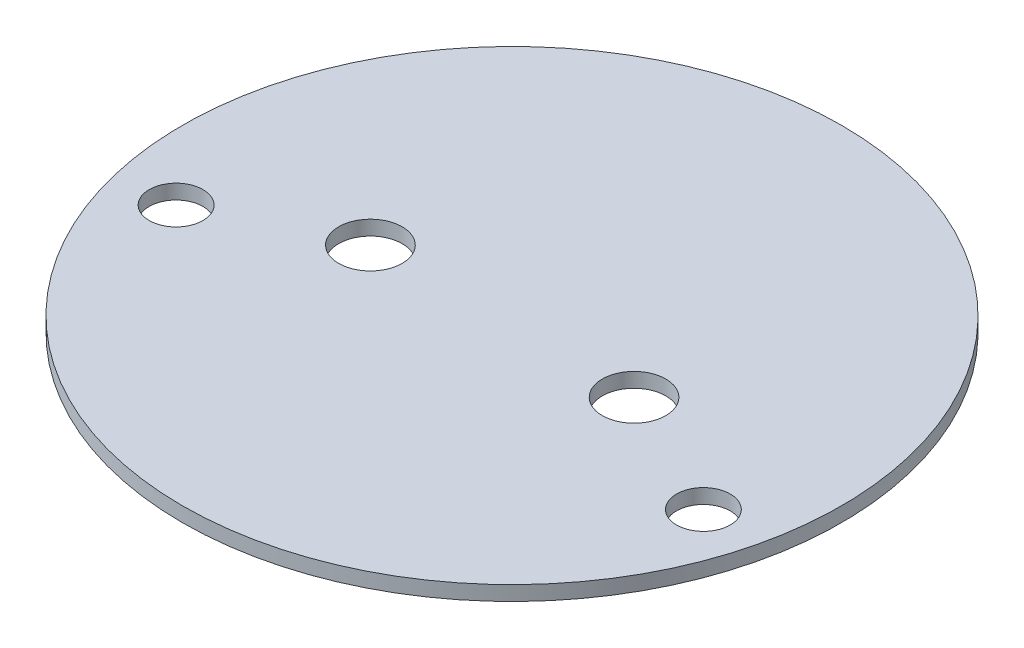
ISO-10303-21;
HEADER;
FILE_DESCRIPTION(('STEP AP214'),'2;1');
FILE_NAME('part.step','',(''),(''),'','','');
FILE_SCHEMA(('AUTOMOTIVE_DESIGN { 1 0 10303 214 1 1 1 1 }'));
ENDSEC;
DATA;
#1=APPLICATION_CONTEXT('core data for automotive mechanical design processes');
#2=APPLICATION_PROTOCOL_DEFINITION('international standard','automotive_design',2000,#1);
#3=PRODUCT_CONTEXT('',#1,'mechanical');
#4=PRODUCT('Part','Part','',(#3));
#5=PRODUCT_RELATED_PRODUCT_CATEGORY('part','',(#4));
#6=PRODUCT_DEFINITION_FORMATION('','',#4);
#7=PRODUCT_DEFINITION_CONTEXT('part definition',#1,'design');
#8=PRODUCT_DEFINITION('design','',#6,#7);
#9=PRODUCT_DEFINITION_SHAPE('','',#8);
#10=(LENGTH_UNIT() NAMED_UNIT(*) SI_UNIT(.MILLI.,.METRE.));
#11=(NAMED_UNIT(*) PLANE_ANGLE_UNIT() SI_UNIT($,.RADIAN.));
#12=(NAMED_UNIT(*) SI_UNIT($,.STERADIAN.) SOLID_ANGLE_UNIT());
#13=UNCERTAINTY_MEASURE_WITH_UNIT(LENGTH_MEASURE(1.E-05),#10,'distance_accuracy_value','');
#14=(GEOMETRIC_REPRESENTATION_CONTEXT(3) GLOBAL_UNCERTAINTY_ASSIGNED_CONTEXT((#13)) GLOBAL_UNIT_ASSIGNED_CONTEXT((#10,
#11,#12)) REPRESENTATION_CONTEXT('',''));
#15=CARTESIAN_POINT('',(0.,0.,0.));
#16=DIRECTION('',(0.,0.,1.));
#17=DIRECTION('',(1.,0.,0.));
#18=AXIS2_PLACEMENT_3D('',#15,#16,#17);
#19=CARTESIAN_POINT('',(0.,1.5,0.));
#20=DIRECTION('',(0.,1.,0.));
#21=DIRECTION('',(0.,0.,1.));
#22=AXIS2_PLACEMENT_3D('',#19,#20,#21);
#23=PLANE('',#22);
#24=CARTESIAN_POINT('',(-13.5,1.5,1.));
#25=DIRECTION('',(0.,1.,0.));
#26=DIRECTION('',(0.,0.,1.));
#27=AXIS2_PLACEMENT_3D('',#24,#25,#26);
#28=CIRCLE('',#27,3.25);
#29=CARTESIAN_POINT('',(-13.5,1.5,4.25));
#30=VERTEX_POINT('',#29);
#31=EDGE_CURVE('E68',#30,#30,#28,.T.);
#32=ORIENTED_EDGE('',*,*,#31,.F.);
#33=EDGE_LOOP('',(#32));
#34=FACE_BOUND('',#33,.T.);
#35=CARTESIAN_POINT('',(-27.,1.5,7.4));
#36=DIRECTION('',(0.,1.,0.));
#37=DIRECTION('',(0.,0.,1.));
#38=AXIS2_PLACEMENT_3D('',#35,#36,#37);
#39=CIRCLE('',#38,2.75);
#40=CARTESIAN_POINT('',(-27.,1.5,10.15));
#41=VERTEX_POINT('',#40);
#42=EDGE_CURVE('E54',#41,#41,#39,.T.);
#43=ORIENTED_EDGE('',*,*,#42,.F.);
#44=EDGE_LOOP('',(#43));
#45=FACE_BOUND('',#44,.T.);
#46=CARTESIAN_POINT('',(0.,1.5,0.));
#47=DIRECTION('',(0.,1.,0.));
#48=DIRECTION('',(0.,0.,1.));
#49=AXIS2_PLACEMENT_3D('',#46,#47,#48);
#50=CIRCLE('',#49,33.75);
#51=CARTESIAN_POINT('',(0.,1.5,33.75));
#52=VERTEX_POINT('',#51);
#53=EDGE_CURVE('E10',#52,#52,#50,.T.);
#54=ORIENTED_EDGE('',*,*,#53,.T.);
#55=EDGE_LOOP('',(#54));
#56=FACE_BOUND('',#55,.T.);
#57=CARTESIAN_POINT('',(27.,1.5,7.4));
#58=DIRECTION('',(0.,1.,0.));
#59=DIRECTION('',(0.,0.,1.));
#60=AXIS2_PLACEMENT_3D('',#57,#58,#59);
#61=CIRCLE('',#60,2.75);
#62=CARTESIAN_POINT('',(27.,1.5,10.15));
#63=VERTEX_POINT('',#62);
#64=EDGE_CURVE('E60',#63,#63,#61,.T.);
#65=ORIENTED_EDGE('',*,*,#64,.F.);
#66=EDGE_LOOP('',(#65));
#67=FACE_BOUND('',#66,.T.);
#68=CARTESIAN_POINT('',(13.5,1.5,1.));
#69=DIRECTION('',(0.,1.,0.));
#70=DIRECTION('',(0.,0.,1.));
#71=AXIS2_PLACEMENT_3D('',#68,#69,#70);
#72=CIRCLE('',#71,3.25);
#73=CARTESIAN_POINT('',(13.5,1.5,4.25));
#74=VERTEX_POINT('',#73);
#75=EDGE_CURVE('E76',#74,#74,#72,.T.);
#76=ORIENTED_EDGE('',*,*,#75,.F.);
#77=EDGE_LOOP('',(#76));
#78=FACE_BOUND('',#77,.T.);
#79=ADVANCED_FACE('F41',(#34,#45,#56,#67,#78),#23,.T.);
#80=CARTESIAN_POINT('',(0.,0.,0.));
#81=DIRECTION('',(0.,1.,0.));
#82=DIRECTION('',(0.,0.,1.));
#83=AXIS2_PLACEMENT_3D('',#80,#81,#82);
#84=PLANE('',#83);
#85=CARTESIAN_POINT('',(0.,0.,0.));
#86=DIRECTION('',(0.,1.,0.));
#87=DIRECTION('',(0.,0.,1.));
#88=AXIS2_PLACEMENT_3D('',#85,#86,#87);
#89=CIRCLE('',#88,33.75);
#90=CARTESIAN_POINT('',(0.,0.,33.75));
#91=VERTEX_POINT('',#90);
#92=EDGE_CURVE('E45',#91,#91,#89,.T.);
#93=ORIENTED_EDGE('',*,*,#92,.F.);
#94=EDGE_LOOP('',(#93));
#95=FACE_BOUND('',#94,.T.);
#96=CARTESIAN_POINT('',(-27.,0.,7.4));
#97=DIRECTION('',(0.,1.,0.));
#98=DIRECTION('',(0.,0.,1.));
#99=AXIS2_PLACEMENT_3D('',#96,#97,#98);
#100=CIRCLE('',#99,2.75);
#101=CARTESIAN_POINT('',(-27.,0.,10.15));
#102=VERTEX_POINT('',#101);
#103=EDGE_CURVE('E56',#102,#102,#100,.T.);
#104=ORIENTED_EDGE('',*,*,#103,.T.);
#105=EDGE_LOOP('',(#104));
#106=FACE_BOUND('',#105,.T.);
#107=CARTESIAN_POINT('',(27.,0.,7.4));
#108=DIRECTION('',(0.,1.,0.));
#109=DIRECTION('',(0.,0.,1.));
#110=AXIS2_PLACEMENT_3D('',#107,#108,#109);
#111=CIRCLE('',#110,2.75);
#112=CARTESIAN_POINT('',(27.,0.,10.15));
#113=VERTEX_POINT('',#112);
#114=EDGE_CURVE('E64',#113,#113,#111,.T.);
#115=ORIENTED_EDGE('',*,*,#114,.T.);
#116=EDGE_LOOP('',(#115));
#117=FACE_BOUND('',#116,.T.);
#118=CARTESIAN_POINT('',(-13.5,0.,1.));
#119=DIRECTION('',(0.,1.,0.));
#120=DIRECTION('',(0.,0.,1.));
#121=AXIS2_PLACEMENT_3D('',#118,#119,#120);
#122=CIRCLE('',#121,3.25);
#123=CARTESIAN_POINT('',(-13.5,0.,4.25));
#124=VERTEX_POINT('',#123);
#125=EDGE_CURVE('E72',#124,#124,#122,.T.);
#126=ORIENTED_EDGE('',*,*,#125,.T.);
#127=EDGE_LOOP('',(#126));
#128=FACE_BOUND('',#127,.T.);
#129=CARTESIAN_POINT('',(13.5,0.,1.));
#130=DIRECTION('',(0.,1.,0.));
#131=DIRECTION('',(0.,0.,1.));
#132=AXIS2_PLACEMENT_3D('',#129,#130,#131);
#133=CIRCLE('',#132,3.25);
#134=CARTESIAN_POINT('',(13.5,0.,4.25));
#135=VERTEX_POINT('',#134);
#136=EDGE_CURVE('E80',#135,#135,#133,.T.);
#137=ORIENTED_EDGE('',*,*,#136,.T.);
#138=EDGE_LOOP('',(#137));
#139=FACE_BOUND('',#138,.T.);
#140=ADVANCED_FACE('F92',(#95,#106,#117,#128,#139),#84,.F.);
#141=CARTESIAN_POINT('',(0.,1.5,0.));
#142=DIRECTION('',(0.,-1.,0.));
#143=DIRECTION('',(0.,0.,-1.));
#144=AXIS2_PLACEMENT_3D('',#141,#142,#143);
#145=CYLINDRICAL_SURFACE('',#144,33.75);
#146=ORIENTED_EDGE('',*,*,#53,.F.);
#147=EDGE_LOOP('',(#146));
#148=FACE_BOUND('',#147,.T.);
#149=ORIENTED_EDGE('',*,*,#92,.T.);
#150=EDGE_LOOP('',(#149));
#151=FACE_BOUND('',#150,.T.);
#152=ADVANCED_FACE('F43',(#148,#151),#145,.T.);
#153=CARTESIAN_POINT('',(-27.,1.5,7.4));
#154=DIRECTION('',(0.,-1.,0.));
#155=DIRECTION('',(0.,0.,-1.));
#156=AXIS2_PLACEMENT_3D('',#153,#154,#155);
#157=CYLINDRICAL_SURFACE('',#156,2.75);
#158=ORIENTED_EDGE('',*,*,#42,.T.);
#159=EDGE_LOOP('',(#158));
#160=FACE_BOUND('',#159,.T.);
#161=ORIENTED_EDGE('',*,*,#103,.F.);
#162=EDGE_LOOP('',(#161));
#163=FACE_BOUND('',#162,.T.);
#164=ADVANCED_FACE('F102',(#160,#163),#157,.F.);
#165=CARTESIAN_POINT('',(27.,1.5,7.4));
#166=DIRECTION('',(0.,-1.,0.));
#167=DIRECTION('',(0.,0.,-1.));
#168=AXIS2_PLACEMENT_3D('',#165,#166,#167);
#169=CYLINDRICAL_SURFACE('',#168,2.75);
#170=ORIENTED_EDGE('',*,*,#64,.T.);
#171=EDGE_LOOP('',(#170));
#172=FACE_BOUND('',#171,.T.);
#173=ORIENTED_EDGE('',*,*,#114,.F.);
#174=EDGE_LOOP('',(#173));
#175=FACE_BOUND('',#174,.T.);
#176=ADVANCED_FACE('F105',(#172,#175),#169,.F.);
#177=CARTESIAN_POINT('',(-13.5,1.5,1.));
#178=DIRECTION('',(0.,-1.,0.));
#179=DIRECTION('',(0.,0.,-1.));
#180=AXIS2_PLACEMENT_3D('',#177,#178,#179);
#181=CYLINDRICAL_SURFACE('',#180,3.25);
#182=ORIENTED_EDGE('',*,*,#31,.T.);
#183=EDGE_LOOP('',(#182));
#184=FACE_BOUND('',#183,.T.);
#185=ORIENTED_EDGE('',*,*,#125,.F.);
#186=EDGE_LOOP('',(#185));
#187=FACE_BOUND('',#186,.T.);
#188=ADVANCED_FACE('F109',(#184,#187),#181,.F.);
#189=CARTESIAN_POINT('',(13.5,1.5,1.));
#190=DIRECTION('',(0.,-1.,0.));
#191=DIRECTION('',(0.,0.,-1.));
#192=AXIS2_PLACEMENT_3D('',#189,#190,#191);
#193=CYLINDRICAL_SURFACE('',#192,3.25);
#194=ORIENTED_EDGE('',*,*,#75,.T.);
#195=EDGE_LOOP('',(#194));
#196=FACE_BOUND('',#195,.T.);
#197=ORIENTED_EDGE('',*,*,#136,.F.);
#198=EDGE_LOOP('',(#197));
#199=FACE_BOUND('',#198,.T.);
#200=ADVANCED_FACE('F88',(#196,#199),#193,.F.);
#201=CLOSED_SHELL('',(#79,#140,#152,#164,#176,#188,#200));
#202=MANIFOLD_SOLID_BREP('B2',#201);
#203=ADVANCED_BREP_SHAPE_REPRESENTATION('',(#18,#202),#14);
#204=SHAPE_DEFINITION_REPRESENTATION(#9,#203);
ENDSEC;
END-ISO-10303-21;
